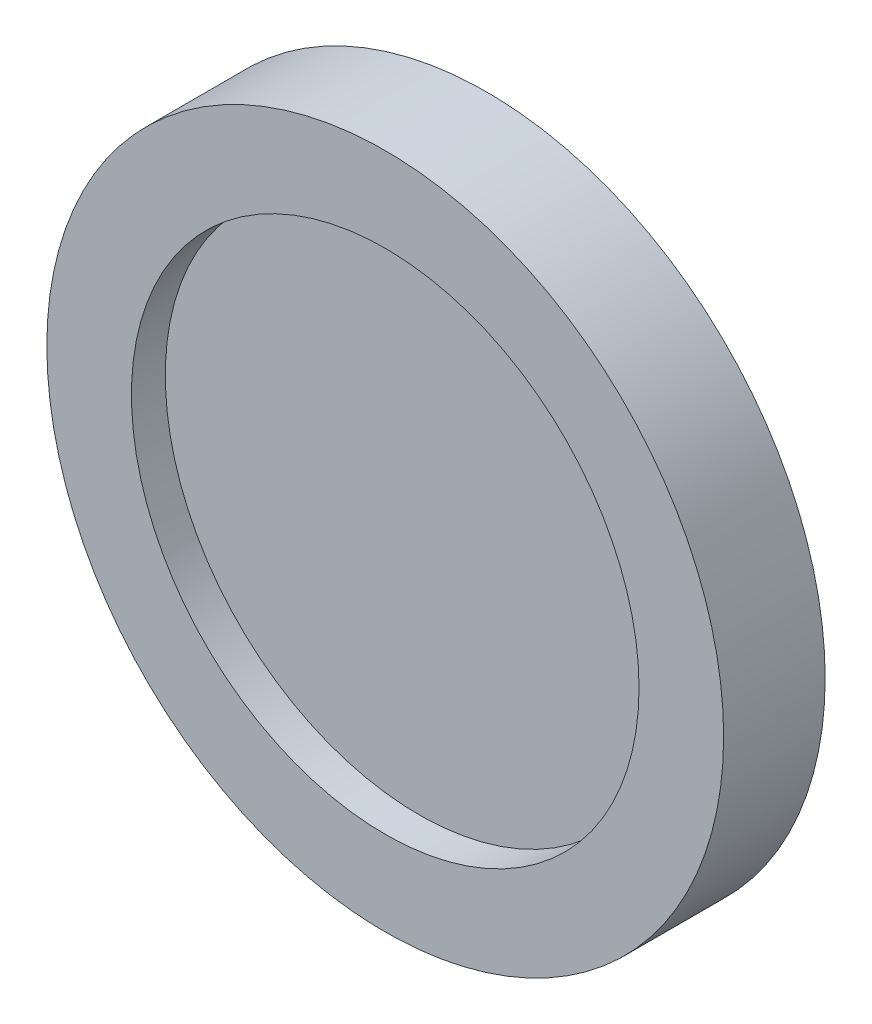
ISO-10303-21;
HEADER;
FILE_DESCRIPTION(('STEP AP214'),'2;1');
FILE_NAME('part.step','',(''),(''),'','','');
FILE_SCHEMA(('AUTOMOTIVE_DESIGN { 1 0 10303 214 1 1 1 1 }'));
ENDSEC;
DATA;
#1=APPLICATION_CONTEXT('core data for automotive mechanical design processes');
#2=APPLICATION_PROTOCOL_DEFINITION('international standard','automotive_design',2000,#1);
#3=PRODUCT_CONTEXT('',#1,'mechanical');
#4=PRODUCT('Part','Part','',(#3));
#5=PRODUCT_RELATED_PRODUCT_CATEGORY('part','',(#4));
#6=PRODUCT_DEFINITION_FORMATION('','',#4);
#7=PRODUCT_DEFINITION_CONTEXT('part definition',#1,'design');
#8=PRODUCT_DEFINITION('design','',#6,#7);
#9=PRODUCT_DEFINITION_SHAPE('','',#8);
#10=(LENGTH_UNIT() NAMED_UNIT(*) SI_UNIT(.MILLI.,.METRE.));
#11=(NAMED_UNIT(*) PLANE_ANGLE_UNIT() SI_UNIT($,.RADIAN.));
#12=(NAMED_UNIT(*) SI_UNIT($,.STERADIAN.) SOLID_ANGLE_UNIT());
#13=UNCERTAINTY_MEASURE_WITH_UNIT(LENGTH_MEASURE(1.E-05),#10,'distance_accuracy_value','');
#14=(GEOMETRIC_REPRESENTATION_CONTEXT(3) GLOBAL_UNCERTAINTY_ASSIGNED_CONTEXT((#13)) GLOBAL_UNIT_ASSIGNED_CONTEXT((#10,
#11,#12)) REPRESENTATION_CONTEXT('',''));
#15=CARTESIAN_POINT('',(0.,0.,0.));
#16=DIRECTION('',(0.,0.,1.));
#17=DIRECTION('',(1.,0.,0.));
#18=AXIS2_PLACEMENT_3D('',#15,#16,#17);
#19=CARTESIAN_POINT('',(0.,0.,30.));
#20=DIRECTION('',(0.,0.,-1.));
#21=DIRECTION('',(-1.,0.,0.));
#22=AXIS2_PLACEMENT_3D('',#19,#20,#21);
#23=CYLINDRICAL_SURFACE('',#22,100.);
#24=CARTESIAN_POINT('',(0.,0.,30.));
#25=DIRECTION('',(0.,0.,1.));
#26=DIRECTION('',(1.,0.,0.));
#27=AXIS2_PLACEMENT_3D('',#24,#25,#26);
#28=CIRCLE('',#27,100.);
#29=CARTESIAN_POINT('',(100.,0.,30.));
#30=VERTEX_POINT('',#29);
#31=EDGE_CURVE('E10',#30,#30,#28,.T.);
#32=ORIENTED_EDGE('',*,*,#31,.F.);
#33=EDGE_LOOP('',(#32));
#34=FACE_BOUND('',#33,.T.);
#35=CARTESIAN_POINT('',(0.,0.,0.));
#36=DIRECTION('',(0.,0.,1.));
#37=DIRECTION('',(1.,0.,0.));
#38=AXIS2_PLACEMENT_3D('',#35,#36,#37);
#39=CIRCLE('',#38,100.);
#40=CARTESIAN_POINT('',(100.,0.,0.));
#41=VERTEX_POINT('',#40);
#42=EDGE_CURVE('E34',#41,#41,#39,.T.);
#43=ORIENTED_EDGE('',*,*,#42,.T.);
#44=EDGE_LOOP('',(#43));
#45=FACE_BOUND('',#44,.T.);
#46=ADVANCED_FACE('F31',(#34,#45),#23,.T.);
#47=CARTESIAN_POINT('',(0.,0.,30.));
#48=DIRECTION('',(0.,0.,1.));
#49=DIRECTION('',(1.,0.,0.));
#50=AXIS2_PLACEMENT_3D('',#47,#48,#49);
#51=PLANE('',#50);
#52=CARTESIAN_POINT('',(0.,0.,30.));
#53=DIRECTION('',(0.,0.,1.));
#54=DIRECTION('',(1.,0.,0.));
#55=AXIS2_PLACEMENT_3D('',#52,#53,#54);
#56=CIRCLE('',#55,75.);
#57=CARTESIAN_POINT('',(75.,0.,30.));
#58=VERTEX_POINT('',#57);
#59=EDGE_CURVE('E43',#58,#58,#56,.T.);
#60=ORIENTED_EDGE('',*,*,#59,.F.);
#61=EDGE_LOOP('',(#60));
#62=FACE_BOUND('',#61,.T.);
#63=ORIENTED_EDGE('',*,*,#31,.T.);
#64=EDGE_LOOP('',(#63));
#65=FACE_BOUND('',#64,.T.);
#66=ADVANCED_FACE('F58',(#62,#65),#51,.T.);
#67=CARTESIAN_POINT('',(0.,0.,0.));
#68=DIRECTION('',(0.,0.,1.));
#69=DIRECTION('',(1.,0.,0.));
#70=AXIS2_PLACEMENT_3D('',#67,#68,#69);
#71=PLANE('',#70);
#72=ORIENTED_EDGE('',*,*,#42,.F.);
#73=EDGE_LOOP('',(#72));
#74=FACE_BOUND('',#73,.T.);
#75=ADVANCED_FACE('F54',(#74),#71,.F.);
#76=CARTESIAN_POINT('',(0.,0.,20.));
#77=DIRECTION('',(0.,0.,1.));
#78=DIRECTION('',(1.,0.,0.));
#79=AXIS2_PLACEMENT_3D('',#76,#77,#78);
#80=CYLINDRICAL_SURFACE('',#79,75.);
#81=CARTESIAN_POINT('',(0.,0.,20.));
#82=DIRECTION('',(0.,0.,1.));
#83=DIRECTION('',(1.,0.,0.));
#84=AXIS2_PLACEMENT_3D('',#81,#82,#83);
#85=CIRCLE('',#84,75.);
#86=CARTESIAN_POINT('',(75.,0.,20.));
#87=VERTEX_POINT('',#86);
#88=EDGE_CURVE('E41',#87,#87,#85,.T.);
#89=ORIENTED_EDGE('',*,*,#88,.F.);
#90=EDGE_LOOP('',(#89));
#91=FACE_BOUND('',#90,.T.);
#92=ORIENTED_EDGE('',*,*,#59,.T.);
#93=EDGE_LOOP('',(#92));
#94=FACE_BOUND('',#93,.T.);
#95=ADVANCED_FACE('F51',(#91,#94),#80,.F.);
#96=CARTESIAN_POINT('',(0.,0.,20.));
#97=DIRECTION('',(0.,0.,1.));
#98=DIRECTION('',(1.,0.,0.));
#99=AXIS2_PLACEMENT_3D('',#96,#97,#98);
#100=PLANE('',#99);
#101=ORIENTED_EDGE('',*,*,#88,.T.);
#102=EDGE_LOOP('',(#101));
#103=FACE_BOUND('',#102,.T.);
#104=ADVANCED_FACE('F49',(#103),#100,.T.);
#105=CLOSED_SHELL('',(#46,#66,#75,#95,#104));
#106=MANIFOLD_SOLID_BREP('B2',#105);
#107=ADVANCED_BREP_SHAPE_REPRESENTATION('',(#18,#106),#14);
#108=SHAPE_DEFINITION_REPRESENTATION(#9,#107);
ENDSEC;
END-ISO-10303-21;
